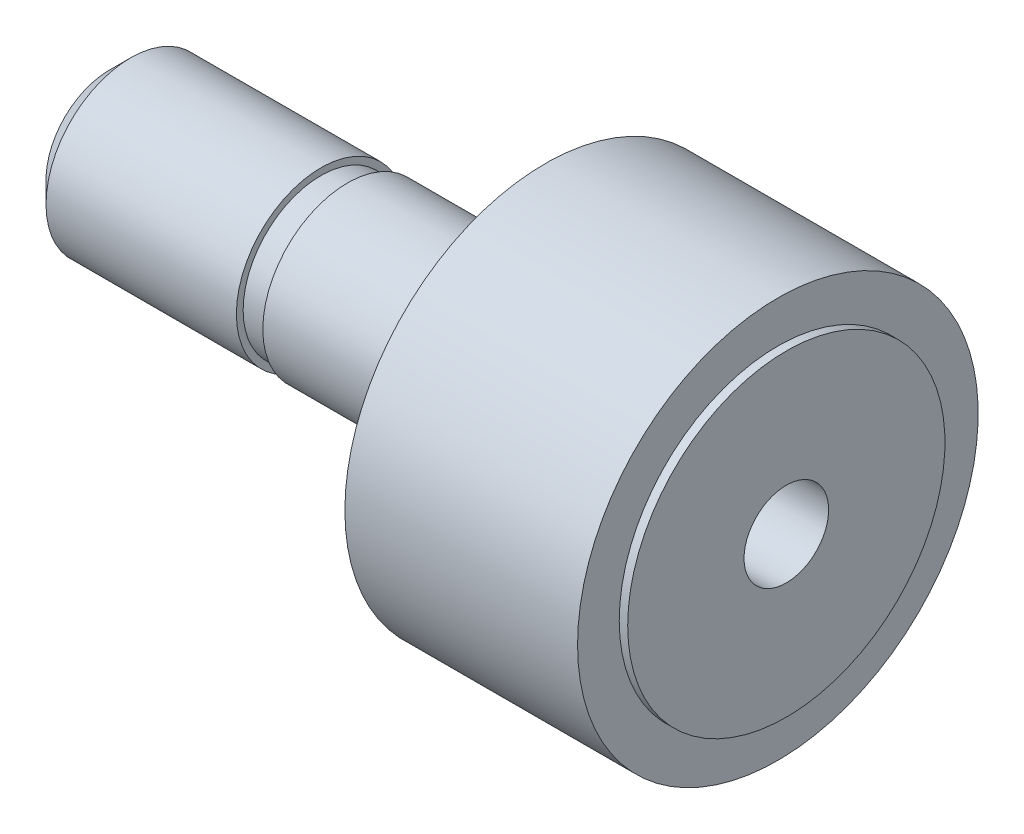
ISO-10303-21;
HEADER;
FILE_DESCRIPTION(('STEP AP214'),'2;1');
FILE_NAME('part.step','',(''),(''),'','','');
FILE_SCHEMA(('AUTOMOTIVE_DESIGN { 1 0 10303 214 1 1 1 1 }'));
ENDSEC;
DATA;
#1=APPLICATION_CONTEXT('core data for automotive mechanical design processes');
#2=APPLICATION_PROTOCOL_DEFINITION('international standard','automotive_design',2000,#1);
#3=PRODUCT_CONTEXT('',#1,'mechanical');
#4=PRODUCT('Part','Part','',(#3));
#5=PRODUCT_RELATED_PRODUCT_CATEGORY('part','',(#4));
#6=PRODUCT_DEFINITION_FORMATION('','',#4);
#7=PRODUCT_DEFINITION_CONTEXT('part definition',#1,'design');
#8=PRODUCT_DEFINITION('design','',#6,#7);
#9=PRODUCT_DEFINITION_SHAPE('','',#8);
#10=(LENGTH_UNIT() NAMED_UNIT(*) SI_UNIT(.MILLI.,.METRE.));
#11=(NAMED_UNIT(*) PLANE_ANGLE_UNIT() SI_UNIT($,.RADIAN.));
#12=(NAMED_UNIT(*) SI_UNIT($,.STERADIAN.) SOLID_ANGLE_UNIT());
#13=UNCERTAINTY_MEASURE_WITH_UNIT(LENGTH_MEASURE(1.E-05),#10,'distance_accuracy_value','');
#14=(GEOMETRIC_REPRESENTATION_CONTEXT(3) GLOBAL_UNCERTAINTY_ASSIGNED_CONTEXT((#13)) GLOBAL_UNIT_ASSIGNED_CONTEXT((#10,
#11,#12)) REPRESENTATION_CONTEXT('',''));
#15=CARTESIAN_POINT('',(0.,0.,0.));
#16=DIRECTION('',(0.,0.,1.));
#17=DIRECTION('',(1.,0.,0.));
#18=AXIS2_PLACEMENT_3D('',#15,#16,#17);
#19=CARTESIAN_POINT('',(15.9384253819037,0.,0.));
#20=DIRECTION('',(-1.,0.,0.));
#21=DIRECTION('',(0.,0.,1.));
#22=AXIS2_PLACEMENT_3D('',#19,#20,#21);
#23=PLANE('',#22);
#24=CARTESIAN_POINT('',(15.9384253819037,0.,0.));
#25=DIRECTION('',(-1.,0.,0.));
#26=DIRECTION('',(0.,0.,1.));
#27=AXIS2_PLACEMENT_3D('',#24,#25,#26);
#28=CIRCLE('',#27,2.);
#29=CARTESIAN_POINT('',(15.9384253819037,0.,2.));
#30=VERTEX_POINT('',#29);
#31=EDGE_CURVE('E48',#30,#30,#28,.T.);
#32=ORIENTED_EDGE('',*,*,#31,.F.);
#33=EDGE_LOOP('',(#32));
#34=FACE_BOUND('',#33,.T.);
#35=ADVANCED_FACE('F36',(#34),#23,.F.);
#36=CARTESIAN_POINT('',(-12.4659224441832,0.,0.));
#37=DIRECTION('',(-1.,0.,0.));
#38=DIRECTION('',(0.,0.,1.));
#39=AXIS2_PLACEMENT_3D('',#36,#37,#38);
#40=CYLINDRICAL_SURFACE('',#39,2.);
#41=CARTESIAN_POINT('',(20.8384253819037,0.,0.));
#42=DIRECTION('',(-1.,0.,0.));
#43=DIRECTION('',(0.,0.,1.));
#44=AXIS2_PLACEMENT_3D('',#41,#42,#43);
#45=CIRCLE('',#44,2.);
#46=CARTESIAN_POINT('',(20.8384253819037,0.,2.));
#47=VERTEX_POINT('',#46);
#48=EDGE_CURVE('E52',#47,#47,#45,.T.);
#49=ORIENTED_EDGE('',*,*,#48,.F.);
#50=EDGE_LOOP('',(#49));
#51=FACE_BOUND('',#50,.T.);
#52=ORIENTED_EDGE('',*,*,#31,.T.);
#53=EDGE_LOOP('',(#52));
#54=FACE_BOUND('',#53,.T.);
#55=ADVANCED_FACE('F156',(#51,#54),#40,.F.);
#56=CARTESIAN_POINT('',(20.8384253819037,2.,0.));
#57=DIRECTION('',(-1.,0.,0.));
#58=DIRECTION('',(0.,0.,1.));
#59=AXIS2_PLACEMENT_3D('',#56,#57,#58);
#60=PLANE('',#59);
#61=CARTESIAN_POINT('',(20.8384253819037,0.,0.));
#62=DIRECTION('',(-1.,0.,0.));
#63=DIRECTION('',(0.,0.,1.));
#64=AXIS2_PLACEMENT_3D('',#61,#62,#63);
#65=CIRCLE('',#64,7.5);
#66=CARTESIAN_POINT('',(20.8384253819037,0.,7.5));
#67=VERTEX_POINT('',#66);
#68=EDGE_CURVE('E57',#67,#67,#65,.T.);
#69=ORIENTED_EDGE('',*,*,#68,.F.);
#70=EDGE_LOOP('',(#69));
#71=FACE_BOUND('',#70,.T.);
#72=ORIENTED_EDGE('',*,*,#48,.T.);
#73=EDGE_LOOP('',(#72));
#74=FACE_BOUND('',#73,.T.);
#75=ADVANCED_FACE('F150',(#71,#74),#60,.F.);
#76=CARTESIAN_POINT('',(-12.4659224441832,0.,0.));
#77=DIRECTION('',(-1.,0.,0.));
#78=DIRECTION('',(0.,0.,1.));
#79=AXIS2_PLACEMENT_3D('',#76,#77,#78);
#80=CYLINDRICAL_SURFACE('',#79,7.5);
#81=CARTESIAN_POINT('',(20.4384253819037,0.,0.));
#82=DIRECTION('',(-1.,0.,0.));
#83=DIRECTION('',(0.,0.,1.));
#84=AXIS2_PLACEMENT_3D('',#81,#82,#83);
#85=CIRCLE('',#84,7.5);
#86=CARTESIAN_POINT('',(20.4384253819037,0.,7.5));
#87=VERTEX_POINT('',#86);
#88=EDGE_CURVE('E60',#87,#87,#85,.T.);
#89=ORIENTED_EDGE('',*,*,#88,.F.);
#90=EDGE_LOOP('',(#89));
#91=FACE_BOUND('',#90,.T.);
#92=ORIENTED_EDGE('',*,*,#68,.T.);
#93=EDGE_LOOP('',(#92));
#94=FACE_BOUND('',#93,.T.);
#95=ADVANCED_FACE('F144',(#91,#94),#80,.T.);
#96=CARTESIAN_POINT('',(20.4384253819037,7.5,0.));
#97=DIRECTION('',(-1.,0.,0.));
#98=DIRECTION('',(0.,0.,1.));
#99=AXIS2_PLACEMENT_3D('',#96,#97,#98);
#100=PLANE('',#99);
#101=CARTESIAN_POINT('',(20.4384253819037,0.,0.));
#102=DIRECTION('',(-1.,0.,0.));
#103=DIRECTION('',(0.,0.,1.));
#104=AXIS2_PLACEMENT_3D('',#101,#102,#103);
#105=CIRCLE('',#104,9.47);
#106=CARTESIAN_POINT('',(20.4384253819037,0.,9.47));
#107=VERTEX_POINT('',#106);
#108=EDGE_CURVE('E63',#107,#107,#105,.T.);
#109=ORIENTED_EDGE('',*,*,#108,.F.);
#110=EDGE_LOOP('',(#109));
#111=FACE_BOUND('',#110,.T.);
#112=ORIENTED_EDGE('',*,*,#88,.T.);
#113=EDGE_LOOP('',(#112));
#114=FACE_BOUND('',#113,.T.);
#115=ADVANCED_FACE('F138',(#111,#114),#100,.F.);
#116=CARTESIAN_POINT('',(-12.4659224441832,0.,0.));
#117=DIRECTION('',(-1.,0.,0.));
#118=DIRECTION('',(0.,0.,1.));
#119=AXIS2_PLACEMENT_3D('',#116,#117,#118);
#120=CYLINDRICAL_SURFACE('',#119,9.47);
#121=CARTESIAN_POINT('',(9.43842538190371,0.,0.));
#122=DIRECTION('',(-1.,0.,0.));
#123=DIRECTION('',(0.,0.,1.));
#124=AXIS2_PLACEMENT_3D('',#121,#122,#123);
#125=CIRCLE('',#124,9.47);
#126=CARTESIAN_POINT('',(9.43842538190371,0.,9.47));
#127=VERTEX_POINT('',#126);
#128=EDGE_CURVE('E66',#127,#127,#125,.T.);
#129=ORIENTED_EDGE('',*,*,#128,.F.);
#130=EDGE_LOOP('',(#129));
#131=FACE_BOUND('',#130,.T.);
#132=ORIENTED_EDGE('',*,*,#108,.T.);
#133=EDGE_LOOP('',(#132));
#134=FACE_BOUND('',#133,.T.);
#135=ADVANCED_FACE('F132',(#131,#134),#120,.T.);
#136=CARTESIAN_POINT('',(9.43842538190371,9.47,0.));
#137=DIRECTION('',(1.,0.,0.));
#138=DIRECTION('',(0.,0.,-1.));
#139=AXIS2_PLACEMENT_3D('',#136,#137,#138);
#140=PLANE('',#139);
#141=CARTESIAN_POINT('',(9.43842538190371,0.,0.));
#142=DIRECTION('',(-1.,0.,0.));
#143=DIRECTION('',(0.,0.,1.));
#144=AXIS2_PLACEMENT_3D('',#141,#142,#143);
#145=CIRCLE('',#144,7.5);
#146=CARTESIAN_POINT('',(9.43842538190371,0.,7.5));
#147=VERTEX_POINT('',#146);
#148=EDGE_CURVE('E69',#147,#147,#145,.T.);
#149=ORIENTED_EDGE('',*,*,#148,.F.);
#150=EDGE_LOOP('',(#149));
#151=FACE_BOUND('',#150,.T.);
#152=ORIENTED_EDGE('',*,*,#128,.T.);
#153=EDGE_LOOP('',(#152));
#154=FACE_BOUND('',#153,.T.);
#155=ADVANCED_FACE('F126',(#151,#154),#140,.F.);
#156=CARTESIAN_POINT('',(-12.4659224441832,0.,0.));
#157=DIRECTION('',(-1.,0.,0.));
#158=DIRECTION('',(0.,0.,1.));
#159=AXIS2_PLACEMENT_3D('',#156,#157,#158);
#160=CYLINDRICAL_SURFACE('',#159,7.5);
#161=CARTESIAN_POINT('',(8.83842538190371,0.,0.));
#162=DIRECTION('',(-1.,0.,0.));
#163=DIRECTION('',(0.,0.,1.));
#164=AXIS2_PLACEMENT_3D('',#161,#162,#163);
#165=CIRCLE('',#164,7.5);
#166=CARTESIAN_POINT('',(8.83842538190371,0.,7.5));
#167=VERTEX_POINT('',#166);
#168=EDGE_CURVE('E72',#167,#167,#165,.T.);
#169=ORIENTED_EDGE('',*,*,#168,.F.);
#170=EDGE_LOOP('',(#169));
#171=FACE_BOUND('',#170,.T.);
#172=ORIENTED_EDGE('',*,*,#148,.T.);
#173=EDGE_LOOP('',(#172));
#174=FACE_BOUND('',#173,.T.);
#175=ADVANCED_FACE('F120',(#171,#174),#160,.T.);
#176=CARTESIAN_POINT('',(8.83842538190371,7.5,0.));
#177=DIRECTION('',(1.,0.,0.));
#178=DIRECTION('',(0.,0.,-1.));
#179=AXIS2_PLACEMENT_3D('',#176,#177,#178);
#180=PLANE('',#179);
#181=CARTESIAN_POINT('',(8.83842538190371,0.,0.));
#182=DIRECTION('',(-1.,0.,0.));
#183=DIRECTION('',(0.,0.,1.));
#184=AXIS2_PLACEMENT_3D('',#181,#182,#183);
#185=CIRCLE('',#184,4.);
#186=CARTESIAN_POINT('',(8.83842538190371,0.,4.));
#187=VERTEX_POINT('',#186);
#188=EDGE_CURVE('E75',#187,#187,#185,.T.);
#189=ORIENTED_EDGE('',*,*,#188,.F.);
#190=EDGE_LOOP('',(#189));
#191=FACE_BOUND('',#190,.T.);
#192=ORIENTED_EDGE('',*,*,#168,.T.);
#193=EDGE_LOOP('',(#192));
#194=FACE_BOUND('',#193,.T.);
#195=ADVANCED_FACE('F114',(#191,#194),#180,.F.);
#196=CARTESIAN_POINT('',(-12.4659224441832,0.,0.));
#197=DIRECTION('',(-1.,0.,0.));
#198=DIRECTION('',(0.,0.,1.));
#199=AXIS2_PLACEMENT_3D('',#196,#197,#198);
#200=CYLINDRICAL_SURFACE('',#199,4.);
#201=CARTESIAN_POINT('',(0.0884253819037062,0.,0.));
#202=DIRECTION('',(-1.,0.,0.));
#203=DIRECTION('',(0.,0.,1.));
#204=AXIS2_PLACEMENT_3D('',#201,#202,#203);
#205=CIRCLE('',#204,4.);
#206=CARTESIAN_POINT('',(0.0884253819037062,0.,4.));
#207=VERTEX_POINT('',#206);
#208=EDGE_CURVE('E78',#207,#207,#205,.T.);
#209=ORIENTED_EDGE('',*,*,#208,.F.);
#210=EDGE_LOOP('',(#209));
#211=FACE_BOUND('',#210,.T.);
#212=ORIENTED_EDGE('',*,*,#188,.T.);
#213=EDGE_LOOP('',(#212));
#214=FACE_BOUND('',#213,.T.);
#215=ADVANCED_FACE('F108',(#211,#214),#200,.T.);
#216=CARTESIAN_POINT('',(0.0884253819037062,4.,0.));
#217=DIRECTION('',(1.,0.,0.));
#218=DIRECTION('',(0.,0.,-1.));
#219=AXIS2_PLACEMENT_3D('',#216,#217,#218);
#220=PLANE('',#219);
#221=CARTESIAN_POINT('',(0.0884253819037062,0.,0.));
#222=DIRECTION('',(-1.,0.,0.));
#223=DIRECTION('',(0.,0.,1.));
#224=AXIS2_PLACEMENT_3D('',#221,#222,#223);
#225=CIRCLE('',#224,3.68);
#226=CARTESIAN_POINT('',(0.0884253819037062,0.,3.68));
#227=VERTEX_POINT('',#226);
#228=EDGE_CURVE('E81',#227,#227,#225,.T.);
#229=ORIENTED_EDGE('',*,*,#228,.F.);
#230=EDGE_LOOP('',(#229));
#231=FACE_BOUND('',#230,.T.);
#232=ORIENTED_EDGE('',*,*,#208,.T.);
#233=EDGE_LOOP('',(#232));
#234=FACE_BOUND('',#233,.T.);
#235=ADVANCED_FACE('F102',(#231,#234),#220,.F.);
#236=CARTESIAN_POINT('',(-12.4659224441832,0.,0.));
#237=DIRECTION('',(-1.,0.,0.));
#238=DIRECTION('',(0.,0.,1.));
#239=AXIS2_PLACEMENT_3D('',#236,#237,#238);
#240=CYLINDRICAL_SURFACE('',#239,3.68);
#241=CARTESIAN_POINT('',(-1.16157461809629,0.,0.));
#242=DIRECTION('',(-1.,0.,0.));
#243=DIRECTION('',(0.,0.,1.));
#244=AXIS2_PLACEMENT_3D('',#241,#242,#243);
#245=CIRCLE('',#244,3.68);
#246=CARTESIAN_POINT('',(-1.16157461809629,0.,3.68));
#247=VERTEX_POINT('',#246);
#248=EDGE_CURVE('E84',#247,#247,#245,.T.);
#249=ORIENTED_EDGE('',*,*,#248,.F.);
#250=EDGE_LOOP('',(#249));
#251=FACE_BOUND('',#250,.T.);
#252=ORIENTED_EDGE('',*,*,#228,.T.);
#253=EDGE_LOOP('',(#252));
#254=FACE_BOUND('',#253,.T.);
#255=ADVANCED_FACE('F96',(#251,#254),#240,.T.);
#256=CARTESIAN_POINT('',(-1.16157461809629,3.68,0.));
#257=DIRECTION('',(-1.,0.,0.));
#258=DIRECTION('',(0.,0.,1.));
#259=AXIS2_PLACEMENT_3D('',#256,#257,#258);
#260=PLANE('',#259);
#261=CARTESIAN_POINT('',(-1.16157461809629,0.,0.));
#262=DIRECTION('',(-1.,0.,0.));
#263=DIRECTION('',(0.,0.,1.));
#264=AXIS2_PLACEMENT_3D('',#261,#262,#263);
#265=CIRCLE('',#264,4.);
#266=CARTESIAN_POINT('',(-1.16157461809629,0.,4.));
#267=VERTEX_POINT('',#266);
#268=EDGE_CURVE('E87',#267,#267,#265,.T.);
#269=ORIENTED_EDGE('',*,*,#268,.F.);
#270=EDGE_LOOP('',(#269));
#271=FACE_BOUND('',#270,.T.);
#272=ORIENTED_EDGE('',*,*,#248,.T.);
#273=EDGE_LOOP('',(#272));
#274=FACE_BOUND('',#273,.T.);
#275=ADVANCED_FACE('F93',(#271,#274),#260,.F.);
#276=CARTESIAN_POINT('',(-12.4659224441832,0.,0.));
#277=DIRECTION('',(-1.,0.,0.));
#278=DIRECTION('',(0.,0.,1.));
#279=AXIS2_PLACEMENT_3D('',#276,#277,#278);
#280=CYLINDRICAL_SURFACE('',#279,4.);
#281=CARTESIAN_POINT('',(-10.1615746180963,0.,0.));
#282=DIRECTION('',(1.,0.,0.));
#283=DIRECTION('',(0.,0.,-1.));
#284=AXIS2_PLACEMENT_3D('',#281,#282,#283);
#285=CIRCLE('',#284,4.);
#286=CARTESIAN_POINT('',(-10.1615746180963,0.,-4.));
#287=VERTEX_POINT('',#286);
#288=EDGE_CURVE('E10',#287,#287,#285,.T.);
#289=ORIENTED_EDGE('',*,*,#288,.T.);
#290=EDGE_LOOP('',(#289));
#291=FACE_BOUND('',#290,.T.);
#292=ORIENTED_EDGE('',*,*,#268,.T.);
#293=EDGE_LOOP('',(#292));
#294=FACE_BOUND('',#293,.T.);
#295=ADVANCED_FACE('F91',(#291,#294),#280,.T.);
#296=CARTESIAN_POINT('',(-11.1615746180963,4.,0.));
#297=DIRECTION('',(1.,0.,0.));
#298=DIRECTION('',(0.,0.,-1.));
#299=AXIS2_PLACEMENT_3D('',#296,#297,#298);
#300=PLANE('',#299);
#301=CARTESIAN_POINT('',(-11.1615746180963,0.,0.));
#302=DIRECTION('',(1.,0.,0.));
#303=DIRECTION('',(0.,0.,-1.));
#304=AXIS2_PLACEMENT_3D('',#301,#302,#303);
#305=CIRCLE('',#304,2.99999999999999);
#306=CARTESIAN_POINT('',(-11.1615746180963,0.,-2.99999999999999));
#307=VERTEX_POINT('',#306);
#308=EDGE_CURVE('E44',#307,#307,#305,.F.);
#309=ORIENTED_EDGE('',*,*,#308,.T.);
#310=EDGE_LOOP('',(#309));
#311=FACE_BOUND('',#310,.T.);
#312=ADVANCED_FACE('F171',(#311),#300,.F.);
#313=CARTESIAN_POINT('',(-11.1615746180963,0.,0.));
#314=DIRECTION('',(1.,0.,0.));
#315=DIRECTION('',(0.,0.,-1.));
#316=AXIS2_PLACEMENT_3D('',#313,#314,#315);
#317=CONICAL_SURFACE('',#316,2.99999999999999,0.785398163397447);
#318=ORIENTED_EDGE('',*,*,#288,.F.);
#319=EDGE_LOOP('',(#318));
#320=FACE_BOUND('',#319,.T.);
#321=ORIENTED_EDGE('',*,*,#308,.F.);
#322=EDGE_LOOP('',(#321));
#323=FACE_BOUND('',#322,.T.);
#324=ADVANCED_FACE('F39',(#320,#323),#317,.T.);
#325=CLOSED_SHELL('',(#35,#55,#75,#95,#115,#135,#155,#175,#195,#215,#235,#255,#275,#295,#312,#324));
#326=MANIFOLD_SOLID_BREP('B2',#325);
#327=ADVANCED_BREP_SHAPE_REPRESENTATION('',(#18,#326),#14);
#328=SHAPE_DEFINITION_REPRESENTATION(#9,#327);
ENDSEC;
END-ISO-10303-21;
